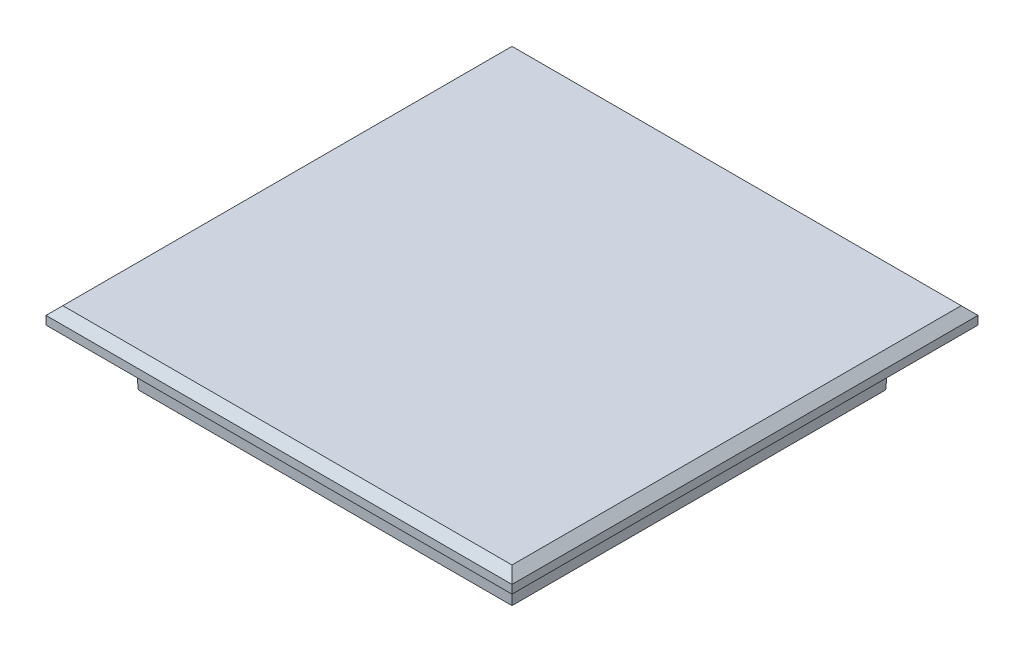
ISO-10303-21;
HEADER;
FILE_DESCRIPTION(('STEP AP214'),'2;1');
FILE_NAME('part.step','',(''),(''),'','','');
FILE_SCHEMA(('AUTOMOTIVE_DESIGN { 1 0 10303 214 1 1 1 1 }'));
ENDSEC;
DATA;
#1=APPLICATION_CONTEXT('core data for automotive mechanical design processes');
#2=APPLICATION_PROTOCOL_DEFINITION('international standard','automotive_design',2000,#1);
#3=PRODUCT_CONTEXT('',#1,'mechanical');
#4=PRODUCT('Part','Part','',(#3));
#5=PRODUCT_RELATED_PRODUCT_CATEGORY('part','',(#4));
#6=PRODUCT_DEFINITION_FORMATION('','',#4);
#7=PRODUCT_DEFINITION_CONTEXT('part definition',#1,'design');
#8=PRODUCT_DEFINITION('design','',#6,#7);
#9=PRODUCT_DEFINITION_SHAPE('','',#8);
#10=(LENGTH_UNIT() NAMED_UNIT(*) SI_UNIT(.MILLI.,.METRE.));
#11=(NAMED_UNIT(*) PLANE_ANGLE_UNIT() SI_UNIT($,.RADIAN.));
#12=(NAMED_UNIT(*) SI_UNIT($,.STERADIAN.) SOLID_ANGLE_UNIT());
#13=UNCERTAINTY_MEASURE_WITH_UNIT(LENGTH_MEASURE(1.E-05),#10,'distance_accuracy_value','');
#14=(GEOMETRIC_REPRESENTATION_CONTEXT(3) GLOBAL_UNCERTAINTY_ASSIGNED_CONTEXT((#13)) GLOBAL_UNIT_ASSIGNED_CONTEXT((#10,
#11,#12)) REPRESENTATION_CONTEXT('',''));
#15=CARTESIAN_POINT('',(0.,0.,0.));
#16=DIRECTION('',(0.,0.,1.));
#17=DIRECTION('',(1.,0.,0.));
#18=AXIS2_PLACEMENT_3D('',#15,#16,#17);
#19=CARTESIAN_POINT('',(-33.8,0.,33.8));
#20=DIRECTION('',(-0.998629534754574,-0.0523359562429439,0.));
#21=DIRECTION('',(0.052335956242944,-0.998629534754574,0.));
#22=AXIS2_PLACEMENT_3D('',#19,#20,#21);
#23=PLANE('',#22);
#24=DIRECTION('',(0.,0.,1.));
#25=VECTOR('',#24,1.);
#26=CARTESIAN_POINT('',(-33.8,0.,33.8));
#27=LINE('',#26,#25);
#28=CARTESIAN_POINT('',(-33.8,0.,-33.8));
#29=VERTEX_POINT('',#28);
#30=CARTESIAN_POINT('',(-33.8,0.,33.8));
#31=VERTEX_POINT('',#30);
#32=EDGE_CURVE('E209',#29,#31,#27,.T.);
#33=ORIENTED_EDGE('',*,*,#32,.F.);
#34=DIRECTION('',(-0.052264427688714,0.997264688634237,-0.052264427688714));
#35=VECTOR('',#34,1.);
#36=CARTESIAN_POINT('',(-33.8,0.,-33.8));
#37=LINE('',#36,#35);
#38=CARTESIAN_POINT('',(-33.2759222071696,-10.,-33.2759222071696));
#39=VERTEX_POINT('',#38);
#40=EDGE_CURVE('E254',#39,#29,#37,.T.);
#41=ORIENTED_EDGE('',*,*,#40,.F.);
#42=DIRECTION('',(0.,0.,1.));
#43=VECTOR('',#42,1.);
#44=CARTESIAN_POINT('',(-33.2759222071696,-10.,33.8));
#45=LINE('',#44,#43);
#46=CARTESIAN_POINT('',(-33.2759222071696,-10.,33.2759222071696));
#47=VERTEX_POINT('',#46);
#48=EDGE_CURVE('E226',#39,#47,#45,.T.);
#49=ORIENTED_EDGE('',*,*,#48,.T.);
#50=DIRECTION('',(-0.052264427688714,0.997264688634237,0.052264427688714));
#51=VECTOR('',#50,1.);
#52=CARTESIAN_POINT('',(-33.8,0.,33.8));
#53=LINE('',#52,#51);
#54=EDGE_CURVE('E260',#47,#31,#53,.T.);
#55=ORIENTED_EDGE('',*,*,#54,.T.);
#56=EDGE_LOOP('',(#33,#41,#49,#55));
#57=FACE_BOUND('',#56,.T.);
#58=ADVANCED_FACE('F45',(#57),#23,.T.);
#59=CARTESIAN_POINT('',(-33.8,0.,-33.8));
#60=DIRECTION('',(0.,-0.0523359562429439,-0.998629534754574));
#61=DIRECTION('',(0.,0.998629534754574,-0.052335956242944));
#62=AXIS2_PLACEMENT_3D('',#59,#60,#61);
#63=PLANE('',#62);
#64=DIRECTION('',(-1.,0.,0.));
#65=VECTOR('',#64,1.);
#66=CARTESIAN_POINT('',(-33.8,0.,-33.8));
#67=LINE('',#66,#65);
#68=CARTESIAN_POINT('',(33.8,0.,-33.8));
#69=VERTEX_POINT('',#68);
#70=EDGE_CURVE('E222',#69,#29,#67,.T.);
#71=ORIENTED_EDGE('',*,*,#70,.F.);
#72=DIRECTION('',(0.052264427688714,0.997264688634237,-0.052264427688714));
#73=VECTOR('',#72,1.);
#74=CARTESIAN_POINT('',(33.6153458408499,-3.52341125070072,-33.6153458408499));
#75=LINE('',#74,#73);
#76=CARTESIAN_POINT('',(33.2759222071696,-10.,-33.2759222071696));
#77=VERTEX_POINT('',#76);
#78=EDGE_CURVE('E259',#77,#69,#75,.T.);
#79=ORIENTED_EDGE('',*,*,#78,.F.);
#80=DIRECTION('',(-1.,0.,0.));
#81=VECTOR('',#80,1.);
#82=CARTESIAN_POINT('',(-33.8,-10.,-33.2759222071696));
#83=LINE('',#82,#81);
#84=EDGE_CURVE('E264',#77,#39,#83,.T.);
#85=ORIENTED_EDGE('',*,*,#84,.T.);
#86=ORIENTED_EDGE('',*,*,#40,.T.);
#87=EDGE_LOOP('',(#71,#79,#85,#86));
#88=FACE_BOUND('',#87,.T.);
#89=ADVANCED_FACE('F390',(#88),#63,.T.);
#90=CARTESIAN_POINT('',(33.8,0.,33.8));
#91=DIRECTION('',(0.998629534754574,-0.0523359562429439,0.));
#92=DIRECTION('',(0.052335956242944,0.998629534754574,0.));
#93=AXIS2_PLACEMENT_3D('',#90,#91,#92);
#94=PLANE('',#93);
#95=DIRECTION('',(0.,0.,-1.));
#96=VECTOR('',#95,1.);
#97=CARTESIAN_POINT('',(33.8,0.,33.8));
#98=LINE('',#97,#96);
#99=CARTESIAN_POINT('',(33.8,0.,33.8));
#100=VERTEX_POINT('',#99);
#101=EDGE_CURVE('E218',#100,#69,#98,.T.);
#102=ORIENTED_EDGE('',*,*,#101,.F.);
#103=DIRECTION('',(0.052264427688714,0.997264688634237,0.052264427688714));
#104=VECTOR('',#103,1.);
#105=CARTESIAN_POINT('',(33.6153458408499,-3.52341125070072,33.6153458408499));
#106=LINE('',#105,#104);
#107=CARTESIAN_POINT('',(33.2759222071696,-10.,33.2759222071696));
#108=VERTEX_POINT('',#107);
#109=EDGE_CURVE('E263',#108,#100,#106,.T.);
#110=ORIENTED_EDGE('',*,*,#109,.F.);
#111=DIRECTION('',(0.,0.,-1.));
#112=VECTOR('',#111,1.);
#113=CARTESIAN_POINT('',(33.2759222071696,-10.,33.8));
#114=LINE('',#113,#112);
#115=EDGE_CURVE('E276',#108,#77,#114,.T.);
#116=ORIENTED_EDGE('',*,*,#115,.T.);
#117=ORIENTED_EDGE('',*,*,#78,.T.);
#118=EDGE_LOOP('',(#102,#110,#116,#117));
#119=FACE_BOUND('',#118,.T.);
#120=ADVANCED_FACE('F396',(#119),#94,.T.);
#121=CARTESIAN_POINT('',(-33.8,0.,33.8));
#122=DIRECTION('',(0.,-0.0523359562429439,0.998629534754574));
#123=DIRECTION('',(0.,-0.998629534754574,-0.052335956242944));
#124=AXIS2_PLACEMENT_3D('',#121,#122,#123);
#125=PLANE('',#124);
#126=DIRECTION('',(1.,0.,0.));
#127=VECTOR('',#126,1.);
#128=CARTESIAN_POINT('',(-33.8,0.,33.8));
#129=LINE('',#128,#127);
#130=EDGE_CURVE('E213',#31,#100,#129,.T.);
#131=ORIENTED_EDGE('',*,*,#130,.F.);
#132=ORIENTED_EDGE('',*,*,#54,.F.);
#133=DIRECTION('',(1.,0.,0.));
#134=VECTOR('',#133,1.);
#135=CARTESIAN_POINT('',(-33.8,-10.,33.2759222071696));
#136=LINE('',#135,#134);
#137=EDGE_CURVE('E272',#47,#108,#136,.T.);
#138=ORIENTED_EDGE('',*,*,#137,.T.);
#139=ORIENTED_EDGE('',*,*,#109,.T.);
#140=EDGE_LOOP('',(#131,#132,#138,#139));
#141=FACE_BOUND('',#140,.T.);
#142=ADVANCED_FACE('F386',(#141),#125,.T.);
#143=CARTESIAN_POINT('',(0.,-10.,0.));
#144=DIRECTION('',(0.,-1.,0.));
#145=DIRECTION('',(0.,0.,-1.));
#146=AXIS2_PLACEMENT_3D('',#143,#144,#145);
#147=PLANE('',#146);
#148=DIRECTION('',(0.,0.,-1.));
#149=VECTOR('',#148,1.);
#150=CARTESIAN_POINT('',(-31.3240777928304,-10.,30.8));
#151=LINE('',#150,#149);
#152=CARTESIAN_POINT('',(-31.3240777928304,-10.,-31.3240777928304));
#153=VERTEX_POINT('',#152);
#154=CARTESIAN_POINT('',(-31.3240777928304,-10.,31.3240777928304));
#155=VERTEX_POINT('',#154);
#156=EDGE_CURVE('E173',#153,#155,#151,.F.);
#157=ORIENTED_EDGE('',*,*,#156,.T.);
#158=DIRECTION('',(-1.,0.,0.));
#159=VECTOR('',#158,1.);
#160=CARTESIAN_POINT('',(-30.8,-10.,31.3240777928304));
#161=LINE('',#160,#159);
#162=CARTESIAN_POINT('',(31.3240777928304,-10.,31.3240777928304));
#163=VERTEX_POINT('',#162);
#164=EDGE_CURVE('E240',#155,#163,#161,.F.);
#165=ORIENTED_EDGE('',*,*,#164,.T.);
#166=DIRECTION('',(0.,0.,1.));
#167=VECTOR('',#166,1.);
#168=CARTESIAN_POINT('',(31.3240777928304,-10.,30.8));
#169=LINE('',#168,#167);
#170=CARTESIAN_POINT('',(31.3240777928304,-10.,-31.3240777928304));
#171=VERTEX_POINT('',#170);
#172=EDGE_CURVE('E244',#163,#171,#169,.F.);
#173=ORIENTED_EDGE('',*,*,#172,.T.);
#174=DIRECTION('',(1.,0.,0.));
#175=VECTOR('',#174,1.);
#176=CARTESIAN_POINT('',(-30.8,-10.,-31.3240777928304));
#177=LINE('',#176,#175);
#178=EDGE_CURVE('E235',#171,#153,#177,.F.);
#179=ORIENTED_EDGE('',*,*,#178,.T.);
#180=EDGE_LOOP('',(#157,#165,#173,#179));
#181=FACE_BOUND('',#180,.T.);
#182=ORIENTED_EDGE('',*,*,#48,.F.);
#183=ORIENTED_EDGE('',*,*,#84,.F.);
#184=ORIENTED_EDGE('',*,*,#115,.F.);
#185=ORIENTED_EDGE('',*,*,#137,.F.);
#186=EDGE_LOOP('',(#182,#183,#184,#185));
#187=FACE_BOUND('',#186,.T.);
#188=ADVANCED_FACE('F373',(#181,#187),#147,.T.);
#189=CARTESIAN_POINT('',(-30.8,0.,30.8));
#190=DIRECTION('',(0.998629534754574,-0.0523359562429439,0.));
#191=DIRECTION('',(0.052335956242944,0.998629534754574,0.));
#192=AXIS2_PLACEMENT_3D('',#189,#190,#191);
#193=PLANE('',#192);
#194=DIRECTION('',(0.052264427688714,0.997264688634237,0.052264427688714));
#195=VECTOR('',#194,1.);
#196=CARTESIAN_POINT('',(-30.8,0.,-30.8));
#197=LINE('',#196,#195);
#198=CARTESIAN_POINT('',(-30.9106125148292,-2.11061251482922,-30.9106125148292));
#199=VERTEX_POINT('',#198);
#200=EDGE_CURVE('E214',#153,#199,#197,.T.);
#201=ORIENTED_EDGE('',*,*,#200,.T.);
#202=DIRECTION('',(0.,0.,-1.));
#203=VECTOR('',#202,1.);
#204=CARTESIAN_POINT('',(-30.9106125148292,-2.11061251482922,30.8));
#205=LINE('',#204,#203);
#206=CARTESIAN_POINT('',(-30.9106125148292,-2.11061251482922,30.9106125148292));
#207=VERTEX_POINT('',#206);
#208=EDGE_CURVE('E56',#199,#207,#205,.F.);
#209=ORIENTED_EDGE('',*,*,#208,.T.);
#210=DIRECTION('',(0.052264427688714,0.997264688634237,-0.052264427688714));
#211=VECTOR('',#210,1.);
#212=CARTESIAN_POINT('',(-30.8,0.,30.8));
#213=LINE('',#212,#211);
#214=EDGE_CURVE('E232',#155,#207,#213,.T.);
#215=ORIENTED_EDGE('',*,*,#214,.F.);
#216=ORIENTED_EDGE('',*,*,#156,.F.);
#217=EDGE_LOOP('',(#201,#209,#215,#216));
#218=FACE_BOUND('',#217,.T.);
#219=ADVANCED_FACE('F378',(#218),#193,.T.);
#220=CARTESIAN_POINT('',(-30.8,0.,-30.8));
#221=DIRECTION('',(0.,-0.0523359562429439,0.998629534754574));
#222=DIRECTION('',(0.,-0.998629534754574,-0.052335956242944));
#223=AXIS2_PLACEMENT_3D('',#220,#221,#222);
#224=PLANE('',#223);
#225=DIRECTION('',(-0.052264427688714,0.997264688634237,0.052264427688714));
#226=VECTOR('',#225,1.);
#227=CARTESIAN_POINT('',(30.6317352632597,3.21068244146693,-30.6317352632597));
#228=LINE('',#227,#226);
#229=CARTESIAN_POINT('',(30.9106125148292,-2.11061251482922,-30.9106125148292));
#230=VERTEX_POINT('',#229);
#231=EDGE_CURVE('E231',#171,#230,#228,.T.);
#232=ORIENTED_EDGE('',*,*,#231,.T.);
#233=DIRECTION('',(1.,0.,0.));
#234=VECTOR('',#233,1.);
#235=CARTESIAN_POINT('',(-30.8,-2.11061251482922,-30.9106125148292));
#236=LINE('',#235,#234);
#237=EDGE_CURVE('E71',#230,#199,#236,.F.);
#238=ORIENTED_EDGE('',*,*,#237,.T.);
#239=ORIENTED_EDGE('',*,*,#200,.F.);
#240=ORIENTED_EDGE('',*,*,#178,.F.);
#241=EDGE_LOOP('',(#232,#238,#239,#240));
#242=FACE_BOUND('',#241,.T.);
#243=ADVANCED_FACE('F370',(#242),#224,.T.);
#244=CARTESIAN_POINT('',(30.8,0.,30.8));
#245=DIRECTION('',(-0.998629534754574,-0.0523359562429439,0.));
#246=DIRECTION('',(0.052335956242944,-0.998629534754574,0.));
#247=AXIS2_PLACEMENT_3D('',#244,#245,#246);
#248=PLANE('',#247);
#249=DIRECTION('',(-0.052264427688714,0.997264688634237,-0.052264427688714));
#250=VECTOR('',#249,1.);
#251=CARTESIAN_POINT('',(30.6317352632597,3.21068244146693,30.6317352632597));
#252=LINE('',#251,#250);
#253=CARTESIAN_POINT('',(30.9106125148292,-2.11061251482922,30.9106125148292));
#254=VERTEX_POINT('',#253);
#255=EDGE_CURVE('E227',#163,#254,#252,.T.);
#256=ORIENTED_EDGE('',*,*,#255,.T.);
#257=DIRECTION('',(0.,0.,1.));
#258=VECTOR('',#257,1.);
#259=CARTESIAN_POINT('',(30.9106125148292,-2.11061251482922,30.8));
#260=LINE('',#259,#258);
#261=EDGE_CURVE('E307',#254,#230,#260,.F.);
#262=ORIENTED_EDGE('',*,*,#261,.T.);
#263=ORIENTED_EDGE('',*,*,#231,.F.);
#264=ORIENTED_EDGE('',*,*,#172,.F.);
#265=EDGE_LOOP('',(#256,#262,#263,#264));
#266=FACE_BOUND('',#265,.T.);
#267=ADVANCED_FACE('F367',(#266),#248,.T.);
#268=CARTESIAN_POINT('',(-30.8,0.,30.8));
#269=DIRECTION('',(0.,-0.0523359562429439,-0.998629534754574));
#270=DIRECTION('',(0.,0.998629534754574,-0.052335956242944));
#271=AXIS2_PLACEMENT_3D('',#268,#269,#270);
#272=PLANE('',#271);
#273=ORIENTED_EDGE('',*,*,#214,.T.);
#274=DIRECTION('',(-1.,0.,0.));
#275=VECTOR('',#274,1.);
#276=CARTESIAN_POINT('',(-30.8,-2.11061251482922,30.9106125148292));
#277=LINE('',#276,#275);
#278=EDGE_CURVE('E11',#207,#254,#277,.F.);
#279=ORIENTED_EDGE('',*,*,#278,.T.);
#280=ORIENTED_EDGE('',*,*,#255,.F.);
#281=ORIENTED_EDGE('',*,*,#164,.F.);
#282=EDGE_LOOP('',(#273,#279,#280,#281));
#283=FACE_BOUND('',#282,.T.);
#284=ADVANCED_FACE('F377',(#283),#272,.T.);
#285=CARTESIAN_POINT('',(0.,0.,0.));
#286=DIRECTION('',(0.,-1.,0.));
#287=DIRECTION('',(0.,0.,-1.));
#288=AXIS2_PLACEMENT_3D('',#285,#286,#287);
#289=PLANE('',#288);
#290=ORIENTED_EDGE('',*,*,#70,.T.);
#291=ORIENTED_EDGE('',*,*,#32,.T.);
#292=ORIENTED_EDGE('',*,*,#130,.T.);
#293=ORIENTED_EDGE('',*,*,#101,.T.);
#294=EDGE_LOOP('',(#290,#291,#292,#293));
#295=FACE_BOUND('',#294,.T.);
#296=DIRECTION('',(0.,0.,-1.));
#297=VECTOR('',#296,1.);
#298=CARTESIAN_POINT('',(41.5,0.,41.5));
#299=LINE('',#298,#297);
#300=CARTESIAN_POINT('',(41.5,0.,41.5));
#301=VERTEX_POINT('',#300);
#302=CARTESIAN_POINT('',(41.5,0.,-41.5));
#303=VERTEX_POINT('',#302);
#304=EDGE_CURVE('E180',#301,#303,#299,.T.);
#305=ORIENTED_EDGE('',*,*,#304,.F.);
#306=DIRECTION('',(1.,0.,0.));
#307=VECTOR('',#306,1.);
#308=CARTESIAN_POINT('',(-41.5,0.,41.5));
#309=LINE('',#308,#307);
#310=CARTESIAN_POINT('',(-41.5,0.,41.5));
#311=VERTEX_POINT('',#310);
#312=EDGE_CURVE('E199',#311,#301,#309,.T.);
#313=ORIENTED_EDGE('',*,*,#312,.F.);
#314=DIRECTION('',(0.,0.,1.));
#315=VECTOR('',#314,1.);
#316=CARTESIAN_POINT('',(-41.5,0.,41.5));
#317=LINE('',#316,#315);
#318=CARTESIAN_POINT('',(-41.5,0.,-41.5));
#319=VERTEX_POINT('',#318);
#320=EDGE_CURVE('E182',#319,#311,#317,.T.);
#321=ORIENTED_EDGE('',*,*,#320,.F.);
#322=DIRECTION('',(-1.,0.,0.));
#323=VECTOR('',#322,1.);
#324=CARTESIAN_POINT('',(-41.5,0.,-41.5));
#325=LINE('',#324,#323);
#326=EDGE_CURVE('E165',#303,#319,#325,.T.);
#327=ORIENTED_EDGE('',*,*,#326,.F.);
#328=EDGE_LOOP('',(#305,#313,#321,#327));
#329=FACE_BOUND('',#328,.T.);
#330=ADVANCED_FACE('F178',(#295,#329),#289,.T.);
#331=CARTESIAN_POINT('',(0.,3.,0.));
#332=DIRECTION('',(0.,-1.,0.));
#333=DIRECTION('',(0.,0.,-1.));
#334=AXIS2_PLACEMENT_3D('',#331,#332,#333);
#335=PLANE('',#334);
#336=DIRECTION('',(0.,0.,1.));
#337=VECTOR('',#336,1.);
#338=CARTESIAN_POINT('',(-40.,3.,0.));
#339=LINE('',#338,#337);
#340=CARTESIAN_POINT('',(-40.,3.,-40.));
#341=VERTEX_POINT('',#340);
#342=CARTESIAN_POINT('',(-40.,3.,40.));
#343=VERTEX_POINT('',#342);
#344=EDGE_CURVE('E288',#341,#343,#339,.T.);
#345=ORIENTED_EDGE('',*,*,#344,.T.);
#346=DIRECTION('',(1.,0.,0.));
#347=VECTOR('',#346,1.);
#348=CARTESIAN_POINT('',(0.,3.,40.));
#349=LINE('',#348,#347);
#350=CARTESIAN_POINT('',(40.,3.,40.));
#351=VERTEX_POINT('',#350);
#352=EDGE_CURVE('E291',#343,#351,#349,.T.);
#353=ORIENTED_EDGE('',*,*,#352,.T.);
#354=DIRECTION('',(0.,0.,-1.));
#355=VECTOR('',#354,1.);
#356=CARTESIAN_POINT('',(40.,3.,0.));
#357=LINE('',#356,#355);
#358=CARTESIAN_POINT('',(40.,3.,-40.));
#359=VERTEX_POINT('',#358);
#360=EDGE_CURVE('E258',#351,#359,#357,.T.);
#361=ORIENTED_EDGE('',*,*,#360,.T.);
#362=DIRECTION('',(-1.,0.,0.));
#363=VECTOR('',#362,1.);
#364=CARTESIAN_POINT('',(0.,3.,-40.));
#365=LINE('',#364,#363);
#366=EDGE_CURVE('E285',#359,#341,#365,.T.);
#367=ORIENTED_EDGE('',*,*,#366,.T.);
#368=EDGE_LOOP('',(#345,#353,#361,#367));
#369=FACE_BOUND('',#368,.T.);
#370=ADVANCED_FACE('F503',(#369),#335,.F.);
#371=CARTESIAN_POINT('',(-41.5,3.,41.5));
#372=DIRECTION('',(0.,0.,-1.));
#373=DIRECTION('',(-1.,0.,0.));
#374=AXIS2_PLACEMENT_3D('',#371,#372,#373);
#375=PLANE('',#374);
#376=DIRECTION('',(0.,-1.,0.));
#377=VECTOR('',#376,1.);
#378=CARTESIAN_POINT('',(41.5,3.,41.5));
#379=LINE('',#378,#377);
#380=CARTESIAN_POINT('',(41.5,1.5,41.5));
#381=VERTEX_POINT('',#380);
#382=EDGE_CURVE('E187',#381,#301,#379,.T.);
#383=ORIENTED_EDGE('',*,*,#382,.F.);
#384=DIRECTION('',(-1.,0.,0.));
#385=VECTOR('',#384,1.);
#386=CARTESIAN_POINT('',(-41.5,1.5,41.5));
#387=LINE('',#386,#385);
#388=CARTESIAN_POINT('',(-41.5,1.5,41.5));
#389=VERTEX_POINT('',#388);
#390=EDGE_CURVE('E295',#381,#389,#387,.T.);
#391=ORIENTED_EDGE('',*,*,#390,.T.);
#392=DIRECTION('',(0.,-1.,0.));
#393=VECTOR('',#392,1.);
#394=CARTESIAN_POINT('',(-41.5,3.,41.5));
#395=LINE('',#394,#393);
#396=EDGE_CURVE('E204',#389,#311,#395,.T.);
#397=ORIENTED_EDGE('',*,*,#396,.T.);
#398=ORIENTED_EDGE('',*,*,#312,.T.);
#399=EDGE_LOOP('',(#383,#391,#397,#398));
#400=FACE_BOUND('',#399,.T.);
#401=ADVANCED_FACE('F495',(#400),#375,.F.);
#402=CARTESIAN_POINT('',(-41.5,3.,41.5));
#403=DIRECTION('',(1.,0.,0.));
#404=DIRECTION('',(0.,0.,-1.));
#405=AXIS2_PLACEMENT_3D('',#402,#403,#404);
#406=PLANE('',#405);
#407=ORIENTED_EDGE('',*,*,#396,.F.);
#408=DIRECTION('',(0.,0.,-1.));
#409=VECTOR('',#408,1.);
#410=CARTESIAN_POINT('',(-41.5,1.5,41.5));
#411=LINE('',#410,#409);
#412=CARTESIAN_POINT('',(-41.5,1.5,-41.5));
#413=VERTEX_POINT('',#412);
#414=EDGE_CURVE('E299',#389,#413,#411,.T.);
#415=ORIENTED_EDGE('',*,*,#414,.T.);
#416=DIRECTION('',(0.,-1.,0.));
#417=VECTOR('',#416,1.);
#418=CARTESIAN_POINT('',(-41.5,3.,-41.5));
#419=LINE('',#418,#417);
#420=EDGE_CURVE('E174',#413,#319,#419,.T.);
#421=ORIENTED_EDGE('',*,*,#420,.T.);
#422=ORIENTED_EDGE('',*,*,#320,.T.);
#423=EDGE_LOOP('',(#407,#415,#421,#422));
#424=FACE_BOUND('',#423,.T.);
#425=ADVANCED_FACE('F488',(#424),#406,.F.);
#426=CARTESIAN_POINT('',(-41.5,3.,-41.5));
#427=DIRECTION('',(0.,0.,1.));
#428=DIRECTION('',(1.,0.,0.));
#429=AXIS2_PLACEMENT_3D('',#426,#427,#428);
#430=PLANE('',#429);
#431=ORIENTED_EDGE('',*,*,#420,.F.);
#432=DIRECTION('',(1.,0.,0.));
#433=VECTOR('',#432,1.);
#434=CARTESIAN_POINT('',(-41.5,1.5,-41.5));
#435=LINE('',#434,#433);
#436=CARTESIAN_POINT('',(41.5,1.5,-41.5));
#437=VERTEX_POINT('',#436);
#438=EDGE_CURVE('E168',#413,#437,#435,.T.);
#439=ORIENTED_EDGE('',*,*,#438,.T.);
#440=DIRECTION('',(0.,-1.,0.));
#441=VECTOR('',#440,1.);
#442=CARTESIAN_POINT('',(41.5,3.,-41.5));
#443=LINE('',#442,#441);
#444=EDGE_CURVE('E161',#437,#303,#443,.T.);
#445=ORIENTED_EDGE('',*,*,#444,.T.);
#446=ORIENTED_EDGE('',*,*,#326,.T.);
#447=EDGE_LOOP('',(#431,#439,#445,#446));
#448=FACE_BOUND('',#447,.T.);
#449=ADVANCED_FACE('F164',(#448),#430,.F.);
#450=CARTESIAN_POINT('',(41.5,3.,41.5));
#451=DIRECTION('',(-1.,0.,0.));
#452=DIRECTION('',(0.,0.,1.));
#453=AXIS2_PLACEMENT_3D('',#450,#451,#452);
#454=PLANE('',#453);
#455=ORIENTED_EDGE('',*,*,#444,.F.);
#456=DIRECTION('',(0.,0.,1.));
#457=VECTOR('',#456,1.);
#458=CARTESIAN_POINT('',(41.5,1.5,41.5));
#459=LINE('',#458,#457);
#460=EDGE_CURVE('E304',#437,#381,#459,.T.);
#461=ORIENTED_EDGE('',*,*,#460,.T.);
#462=ORIENTED_EDGE('',*,*,#382,.T.);
#463=ORIENTED_EDGE('',*,*,#304,.T.);
#464=EDGE_LOOP('',(#455,#461,#462,#463));
#465=FACE_BOUND('',#464,.T.);
#466=ADVANCED_FACE('F185',(#465),#454,.F.);
#467=DIRECTION('',(1.,0.,0.));
#468=VECTOR('',#467,1.);
#469=CARTESIAN_POINT('',(0.,0.,-28.8));
#470=LINE('',#469,#468);
#471=CARTESIAN_POINT('',(-28.8,0.,-28.8));
#472=VERTEX_POINT('',#471);
#473=CARTESIAN_POINT('',(28.8,0.,-28.8));
#474=VERTEX_POINT('',#473);
#475=EDGE_CURVE('E326',#472,#474,#470,.T.);
#476=ORIENTED_EDGE('',*,*,#475,.T.);
#477=DIRECTION('',(0.,0.,1.));
#478=VECTOR('',#477,1.);
#479=CARTESIAN_POINT('',(28.8,0.,0.));
#480=LINE('',#479,#478);
#481=CARTESIAN_POINT('',(28.8,0.,28.8));
#482=VERTEX_POINT('',#481);
#483=EDGE_CURVE('E329',#474,#482,#480,.T.);
#484=ORIENTED_EDGE('',*,*,#483,.T.);
#485=DIRECTION('',(-1.,0.,0.));
#486=VECTOR('',#485,1.);
#487=CARTESIAN_POINT('',(0.,0.,28.8));
#488=LINE('',#487,#486);
#489=CARTESIAN_POINT('',(-28.8,0.,28.8));
#490=VERTEX_POINT('',#489);
#491=EDGE_CURVE('E320',#482,#490,#488,.T.);
#492=ORIENTED_EDGE('',*,*,#491,.T.);
#493=DIRECTION('',(0.,0.,-1.));
#494=VECTOR('',#493,1.);
#495=CARTESIAN_POINT('',(-28.8,0.,0.));
#496=LINE('',#495,#494);
#497=EDGE_CURVE('E323',#490,#472,#496,.T.);
#498=ORIENTED_EDGE('',*,*,#497,.T.);
#499=EDGE_LOOP('',(#476,#484,#492,#498));
#500=FACE_BOUND('',#499,.T.);
#501=ADVANCED_FACE('F359',(#500),#289,.T.);
#502=CARTESIAN_POINT('',(0.,3.,-40.));
#503=DIRECTION('',(0.,-0.707106781186544,0.707106781186551));
#504=DIRECTION('',(-1.,0.,0.));
#505=AXIS2_PLACEMENT_3D('',#502,#503,#504);
#506=PLANE('',#505);
#507=DIRECTION('',(-0.577350269189624,0.577350269189629,0.577350269189624));
#508=VECTOR('',#507,1.);
#509=CARTESIAN_POINT('',(26.6666666666668,16.3333333333334,-26.6666666666668));
#510=LINE('',#509,#508);
#511=EDGE_CURVE('E194',#437,#359,#510,.T.);
#512=ORIENTED_EDGE('',*,*,#511,.F.);
#513=ORIENTED_EDGE('',*,*,#438,.F.);
#514=DIRECTION('',(0.577350269189624,0.577350269189629,0.577350269189624));
#515=VECTOR('',#514,1.);
#516=CARTESIAN_POINT('',(-26.6666666666668,16.3333333333334,-26.6666666666667));
#517=LINE('',#516,#515);
#518=EDGE_CURVE('E190',#341,#413,#517,.F.);
#519=ORIENTED_EDGE('',*,*,#518,.F.);
#520=ORIENTED_EDGE('',*,*,#366,.F.);
#521=EDGE_LOOP('',(#512,#513,#519,#520));
#522=FACE_BOUND('',#521,.T.);
#523=ADVANCED_FACE('F428',(#522),#506,.F.);
#524=CARTESIAN_POINT('',(-40.,3.,0.));
#525=DIRECTION('',(0.707106781186551,-0.707106781186544,0.));
#526=DIRECTION('',(0.,0.,1.));
#527=AXIS2_PLACEMENT_3D('',#524,#525,#526);
#528=PLANE('',#527);
#529=ORIENTED_EDGE('',*,*,#518,.T.);
#530=ORIENTED_EDGE('',*,*,#414,.F.);
#531=DIRECTION('',(0.577350269189624,0.577350269189629,-0.577350269189624));
#532=VECTOR('',#531,1.);
#533=CARTESIAN_POINT('',(-26.6666666666668,16.3333333333334,26.6666666666668));
#534=LINE('',#533,#532);
#535=EDGE_CURVE('E311',#343,#389,#534,.F.);
#536=ORIENTED_EDGE('',*,*,#535,.F.);
#537=ORIENTED_EDGE('',*,*,#344,.F.);
#538=EDGE_LOOP('',(#529,#530,#536,#537));
#539=FACE_BOUND('',#538,.T.);
#540=ADVANCED_FACE('F421',(#539),#528,.F.);
#541=CARTESIAN_POINT('',(40.,3.,0.));
#542=DIRECTION('',(-0.707106781186551,-0.707106781186544,0.));
#543=DIRECTION('',(0.,0.,-1.));
#544=AXIS2_PLACEMENT_3D('',#541,#542,#543);
#545=PLANE('',#544);
#546=ORIENTED_EDGE('',*,*,#511,.T.);
#547=ORIENTED_EDGE('',*,*,#360,.F.);
#548=DIRECTION('',(0.577350269189624,-0.577350269189629,0.577350269189624));
#549=VECTOR('',#548,1.);
#550=CARTESIAN_POINT('',(26.6666666666667,16.3333333333334,26.6666666666668));
#551=LINE('',#550,#549);
#552=EDGE_CURVE('E308',#381,#351,#551,.F.);
#553=ORIENTED_EDGE('',*,*,#552,.F.);
#554=ORIENTED_EDGE('',*,*,#460,.F.);
#555=EDGE_LOOP('',(#546,#547,#553,#554));
#556=FACE_BOUND('',#555,.T.);
#557=ADVANCED_FACE('F414',(#556),#545,.F.);
#558=CARTESIAN_POINT('',(0.,3.,40.));
#559=DIRECTION('',(0.,-0.707106781186544,-0.707106781186551));
#560=DIRECTION('',(1.,0.,0.));
#561=AXIS2_PLACEMENT_3D('',#558,#559,#560);
#562=PLANE('',#561);
#563=ORIENTED_EDGE('',*,*,#535,.T.);
#564=ORIENTED_EDGE('',*,*,#390,.F.);
#565=ORIENTED_EDGE('',*,*,#552,.T.);
#566=ORIENTED_EDGE('',*,*,#352,.F.);
#567=EDGE_LOOP('',(#563,#564,#565,#566));
#568=FACE_BOUND('',#567,.T.);
#569=ADVANCED_FACE('F408',(#568),#562,.F.);
#570=CARTESIAN_POINT('',(-30.9106125148292,-2.11061251482922,30.8));
#571=DIRECTION('',(0.707106781186552,-0.707106781186544,0.));
#572=DIRECTION('',(0.,0.,-1.));
#573=AXIS2_PLACEMENT_3D('',#570,#571,#572);
#574=PLANE('',#573);
#575=DIRECTION('',(0.577350269189624,0.57735026918963,0.577350269189623));
#576=VECTOR('',#575,1.);
#577=CARTESIAN_POINT('',(-30.8737416765528,-2.07374167655282,-30.8737416765528));
#578=LINE('',#577,#576);
#579=EDGE_CURVE('E342',#472,#199,#578,.F.);
#580=ORIENTED_EDGE('',*,*,#579,.F.);
#581=ORIENTED_EDGE('',*,*,#497,.F.);
#582=DIRECTION('',(0.577350269189624,0.57735026918963,-0.577350269189624));
#583=VECTOR('',#582,1.);
#584=CARTESIAN_POINT('',(-30.8737416765528,-2.07374167655282,30.8737416765528));
#585=LINE('',#584,#583);
#586=EDGE_CURVE('E50',#207,#490,#585,.T.);
#587=ORIENTED_EDGE('',*,*,#586,.F.);
#588=ORIENTED_EDGE('',*,*,#208,.F.);
#589=EDGE_LOOP('',(#580,#581,#587,#588));
#590=FACE_BOUND('',#589,.T.);
#591=ADVANCED_FACE('F48',(#590),#574,.T.);
#592=CARTESIAN_POINT('',(-30.8,-2.11061251482922,30.9106125148292));
#593=DIRECTION('',(0.,-0.707106781186543,-0.707106781186551));
#594=DIRECTION('',(-1.,0.,0.));
#595=AXIS2_PLACEMENT_3D('',#592,#593,#594);
#596=PLANE('',#595);
#597=ORIENTED_EDGE('',*,*,#586,.T.);
#598=ORIENTED_EDGE('',*,*,#491,.F.);
#599=DIRECTION('',(0.577350269189624,-0.57735026918963,0.577350269189624));
#600=VECTOR('',#599,1.);
#601=CARTESIAN_POINT('',(30.8737416765528,-2.07374167655282,30.8737416765528));
#602=LINE('',#601,#600);
#603=EDGE_CURVE('E340',#254,#482,#602,.F.);
#604=ORIENTED_EDGE('',*,*,#603,.F.);
#605=ORIENTED_EDGE('',*,*,#278,.F.);
#606=EDGE_LOOP('',(#597,#598,#604,#605));
#607=FACE_BOUND('',#606,.T.);
#608=ADVANCED_FACE('F354',(#607),#596,.T.);
#609=CARTESIAN_POINT('',(-30.8,-2.11061251482922,-30.9106125148292));
#610=DIRECTION('',(0.,-0.707106781186543,0.707106781186552));
#611=DIRECTION('',(1.,0.,0.));
#612=AXIS2_PLACEMENT_3D('',#609,#610,#611);
#613=PLANE('',#612);
#614=ORIENTED_EDGE('',*,*,#579,.T.);
#615=ORIENTED_EDGE('',*,*,#237,.F.);
#616=DIRECTION('',(-0.577350269189624,0.57735026918963,0.577350269189623));
#617=VECTOR('',#616,1.);
#618=CARTESIAN_POINT('',(10.3404083432196,18.4595916567806,-10.3404083432196));
#619=LINE('',#618,#617);
#620=EDGE_CURVE('E337',#474,#230,#619,.F.);
#621=ORIENTED_EDGE('',*,*,#620,.F.);
#622=ORIENTED_EDGE('',*,*,#475,.F.);
#623=EDGE_LOOP('',(#614,#615,#621,#622));
#624=FACE_BOUND('',#623,.T.);
#625=ADVANCED_FACE('F365',(#624),#613,.T.);
#626=CARTESIAN_POINT('',(30.9106125148292,-2.11061251482922,30.8));
#627=DIRECTION('',(-0.707106781186551,-0.707106781186544,0.));
#628=DIRECTION('',(0.,0.,1.));
#629=AXIS2_PLACEMENT_3D('',#626,#627,#628);
#630=PLANE('',#629);
#631=ORIENTED_EDGE('',*,*,#603,.T.);
#632=ORIENTED_EDGE('',*,*,#483,.F.);
#633=ORIENTED_EDGE('',*,*,#620,.T.);
#634=ORIENTED_EDGE('',*,*,#261,.F.);
#635=EDGE_LOOP('',(#631,#632,#633,#634));
#636=FACE_BOUND('',#635,.T.);
#637=ADVANCED_FACE('F363',(#636),#630,.T.);
#638=CLOSED_SHELL('',(#58,#89,#120,#142,#188,#219,#243,#267,#284,#330,#370,#401,#425,#449,#466,
#501,#523,#540,#557,#569,#591,#608,#625,#637));
#639=MANIFOLD_SOLID_BREP('B2',#638);
#640=ADVANCED_BREP_SHAPE_REPRESENTATION('',(#18,#639),#14);
#641=SHAPE_DEFINITION_REPRESENTATION(#9,#640);
ENDSEC;
END-ISO-10303-21;
